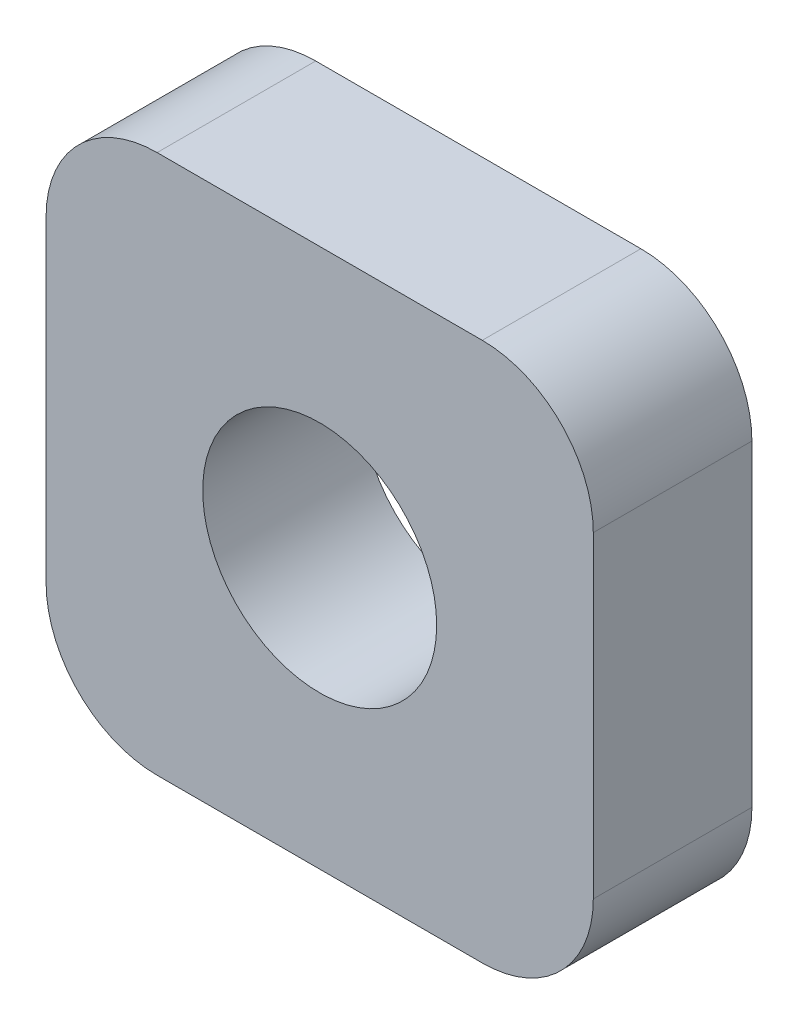
ISO-10303-21;
HEADER;
FILE_DESCRIPTION(('STEP AP214'),'2;1');
FILE_NAME('part.step','',(''),(''),'','','');
FILE_SCHEMA(('AUTOMOTIVE_DESIGN { 1 0 10303 214 1 1 1 1 }'));
ENDSEC;
DATA;
#1=APPLICATION_CONTEXT('core data for automotive mechanical design processes');
#2=APPLICATION_PROTOCOL_DEFINITION('international standard','automotive_design',2000,#1);
#3=PRODUCT_CONTEXT('',#1,'mechanical');
#4=PRODUCT('Part','Part','',(#3));
#5=PRODUCT_RELATED_PRODUCT_CATEGORY('part','',(#4));
#6=PRODUCT_DEFINITION_FORMATION('','',#4);
#7=PRODUCT_DEFINITION_CONTEXT('part definition',#1,'design');
#8=PRODUCT_DEFINITION('design','',#6,#7);
#9=PRODUCT_DEFINITION_SHAPE('','',#8);
#10=(LENGTH_UNIT() NAMED_UNIT(*) SI_UNIT(.MILLI.,.METRE.));
#11=(NAMED_UNIT(*) PLANE_ANGLE_UNIT() SI_UNIT($,.RADIAN.));
#12=(NAMED_UNIT(*) SI_UNIT($,.STERADIAN.) SOLID_ANGLE_UNIT());
#13=UNCERTAINTY_MEASURE_WITH_UNIT(LENGTH_MEASURE(1.E-05),#10,'distance_accuracy_value','');
#14=(GEOMETRIC_REPRESENTATION_CONTEXT(3) GLOBAL_UNCERTAINTY_ASSIGNED_CONTEXT((#13)) GLOBAL_UNIT_ASSIGNED_CONTEXT((#10,
#11,#12)) REPRESENTATION_CONTEXT('',''));
#15=CARTESIAN_POINT('',(0.,0.,0.));
#16=DIRECTION('',(0.,0.,1.));
#17=DIRECTION('',(1.,0.,0.));
#18=AXIS2_PLACEMENT_3D('',#15,#16,#17);
#19=CARTESIAN_POINT('',(-2.05,7.,2.));
#20=DIRECTION('',(0.,0.,1.));
#21=DIRECTION('',(1.,0.,0.));
#22=AXIS2_PLACEMENT_3D('',#19,#20,#21);
#23=PLANE('',#22);
#24=CARTESIAN_POINT('',(-2.05,7.,2.));
#25=DIRECTION('',(0.,0.,1.));
#26=DIRECTION('',(1.,0.,0.));
#27=AXIS2_PLACEMENT_3D('',#24,#25,#26);
#28=CIRCLE('',#27,1.4);
#29=CARTESIAN_POINT('',(-2.05,8.4,2.));
#30=VERTEX_POINT('',#29);
#31=CARTESIAN_POINT('',(-3.45,7.,2.));
#32=VERTEX_POINT('',#31);
#33=EDGE_CURVE('E168',#30,#32,#28,.T.);
#34=ORIENTED_EDGE('',*,*,#33,.T.);
#35=DIRECTION('',(0.,-1.,0.));
#36=VECTOR('',#35,1.);
#37=CARTESIAN_POINT('',(-3.45,7.,2.));
#38=LINE('',#37,#36);
#39=CARTESIAN_POINT('',(-3.45,3.,2.));
#40=VERTEX_POINT('',#39);
#41=EDGE_CURVE('E104',#32,#40,#38,.T.);
#42=ORIENTED_EDGE('',*,*,#41,.T.);
#43=CARTESIAN_POINT('',(-2.05,3.,2.));
#44=DIRECTION('',(0.,0.,1.));
#45=DIRECTION('',(1.,0.,0.));
#46=AXIS2_PLACEMENT_3D('',#43,#44,#45);
#47=CIRCLE('',#46,1.4);
#48=CARTESIAN_POINT('',(-2.05,1.6,2.));
#49=VERTEX_POINT('',#48);
#50=EDGE_CURVE('E189',#40,#49,#47,.T.);
#51=ORIENTED_EDGE('',*,*,#50,.T.);
#52=DIRECTION('',(1.,0.,0.));
#53=VECTOR('',#52,1.);
#54=CARTESIAN_POINT('',(-2.05,1.6,2.));
#55=LINE('',#54,#53);
#56=CARTESIAN_POINT('',(2.05,1.6,2.));
#57=VERTEX_POINT('',#56);
#58=EDGE_CURVE('E203',#49,#57,#55,.T.);
#59=ORIENTED_EDGE('',*,*,#58,.T.);
#60=CARTESIAN_POINT('',(2.05,3.,2.));
#61=DIRECTION('',(0.,0.,1.));
#62=DIRECTION('',(1.,0.,0.));
#63=AXIS2_PLACEMENT_3D('',#60,#61,#62);
#64=CIRCLE('',#63,1.4);
#65=CARTESIAN_POINT('',(3.45,3.,2.));
#66=VERTEX_POINT('',#65);
#67=EDGE_CURVE('E123',#57,#66,#64,.T.);
#68=ORIENTED_EDGE('',*,*,#67,.T.);
#69=DIRECTION('',(0.,1.,0.));
#70=VECTOR('',#69,1.);
#71=CARTESIAN_POINT('',(3.45,3.,2.));
#72=LINE('',#71,#70);
#73=CARTESIAN_POINT('',(3.45,7.,2.));
#74=VERTEX_POINT('',#73);
#75=EDGE_CURVE('E117',#66,#74,#72,.T.);
#76=ORIENTED_EDGE('',*,*,#75,.T.);
#77=CARTESIAN_POINT('',(2.05,7.,2.));
#78=DIRECTION('',(0.,0.,1.));
#79=DIRECTION('',(1.,0.,0.));
#80=AXIS2_PLACEMENT_3D('',#77,#78,#79);
#81=CIRCLE('',#80,1.4);
#82=CARTESIAN_POINT('',(2.05,8.4,2.));
#83=VERTEX_POINT('',#82);
#84=EDGE_CURVE('E121',#74,#83,#81,.T.);
#85=ORIENTED_EDGE('',*,*,#84,.T.);
#86=DIRECTION('',(-1.,0.,0.));
#87=VECTOR('',#86,1.);
#88=CARTESIAN_POINT('',(2.05,8.4,2.));
#89=LINE('',#88,#87);
#90=EDGE_CURVE('E61',#83,#30,#89,.T.);
#91=ORIENTED_EDGE('',*,*,#90,.T.);
#92=EDGE_LOOP('',(#34,#42,#51,#59,#68,#76,#85,#91));
#93=FACE_BOUND('',#92,.T.);
#94=CARTESIAN_POINT('',(0.,5.,2.));
#95=DIRECTION('',(0.,0.,1.));
#96=DIRECTION('',(1.,0.,0.));
#97=AXIS2_PLACEMENT_3D('',#94,#95,#96);
#98=CIRCLE('',#97,1.475);
#99=CARTESIAN_POINT('',(1.475,5.,2.));
#100=VERTEX_POINT('',#99);
#101=EDGE_CURVE('E150',#100,#100,#98,.T.);
#102=ORIENTED_EDGE('',*,*,#101,.F.);
#103=EDGE_LOOP('',(#102));
#104=FACE_BOUND('',#103,.T.);
#105=ADVANCED_FACE('F43',(#93,#104),#23,.T.);
#106=CARTESIAN_POINT('',(-2.05,7.,0.));
#107=DIRECTION('',(0.,0.,1.));
#108=DIRECTION('',(1.,0.,0.));
#109=AXIS2_PLACEMENT_3D('',#106,#107,#108);
#110=PLANE('',#109);
#111=CARTESIAN_POINT('',(-2.05,7.,0.));
#112=DIRECTION('',(0.,0.,1.));
#113=DIRECTION('',(1.,0.,0.));
#114=AXIS2_PLACEMENT_3D('',#111,#112,#113);
#115=CIRCLE('',#114,1.4);
#116=CARTESIAN_POINT('',(-2.05,8.4,0.));
#117=VERTEX_POINT('',#116);
#118=CARTESIAN_POINT('',(-3.45,7.,0.));
#119=VERTEX_POINT('',#118);
#120=EDGE_CURVE('E145',#117,#119,#115,.T.);
#121=ORIENTED_EDGE('',*,*,#120,.F.);
#122=DIRECTION('',(-1.,0.,0.));
#123=VECTOR('',#122,1.);
#124=CARTESIAN_POINT('',(2.05,8.4,0.));
#125=LINE('',#124,#123);
#126=CARTESIAN_POINT('',(2.05,8.4,0.));
#127=VERTEX_POINT('',#126);
#128=EDGE_CURVE('E96',#127,#117,#125,.T.);
#129=ORIENTED_EDGE('',*,*,#128,.F.);
#130=CARTESIAN_POINT('',(2.05,7.,0.));
#131=DIRECTION('',(0.,0.,1.));
#132=DIRECTION('',(1.,0.,0.));
#133=AXIS2_PLACEMENT_3D('',#130,#131,#132);
#134=CIRCLE('',#133,1.4);
#135=CARTESIAN_POINT('',(3.45,7.,0.));
#136=VERTEX_POINT('',#135);
#137=EDGE_CURVE('E90',#136,#127,#134,.T.);
#138=ORIENTED_EDGE('',*,*,#137,.F.);
#139=DIRECTION('',(0.,1.,0.));
#140=VECTOR('',#139,1.);
#141=CARTESIAN_POINT('',(3.45,3.,0.));
#142=LINE('',#141,#140);
#143=CARTESIAN_POINT('',(3.45,3.,0.));
#144=VERTEX_POINT('',#143);
#145=EDGE_CURVE('E132',#144,#136,#142,.T.);
#146=ORIENTED_EDGE('',*,*,#145,.F.);
#147=CARTESIAN_POINT('',(2.05,3.,0.));
#148=DIRECTION('',(0.,0.,1.));
#149=DIRECTION('',(1.,0.,0.));
#150=AXIS2_PLACEMENT_3D('',#147,#148,#149);
#151=CIRCLE('',#150,1.4);
#152=CARTESIAN_POINT('',(2.05,1.6,0.));
#153=VERTEX_POINT('',#152);
#154=EDGE_CURVE('E159',#153,#144,#151,.T.);
#155=ORIENTED_EDGE('',*,*,#154,.F.);
#156=DIRECTION('',(1.,0.,0.));
#157=VECTOR('',#156,1.);
#158=CARTESIAN_POINT('',(-2.05,1.6,0.));
#159=LINE('',#158,#157);
#160=CARTESIAN_POINT('',(-2.05,1.6,0.));
#161=VERTEX_POINT('',#160);
#162=EDGE_CURVE('E156',#161,#153,#159,.T.);
#163=ORIENTED_EDGE('',*,*,#162,.F.);
#164=CARTESIAN_POINT('',(-2.05,3.,0.));
#165=DIRECTION('',(0.,0.,1.));
#166=DIRECTION('',(1.,0.,0.));
#167=AXIS2_PLACEMENT_3D('',#164,#165,#166);
#168=CIRCLE('',#167,1.4);
#169=CARTESIAN_POINT('',(-3.45,3.,0.));
#170=VERTEX_POINT('',#169);
#171=EDGE_CURVE('E153',#170,#161,#168,.T.);
#172=ORIENTED_EDGE('',*,*,#171,.F.);
#173=DIRECTION('',(0.,-1.,0.));
#174=VECTOR('',#173,1.);
#175=CARTESIAN_POINT('',(-3.45,7.,0.));
#176=LINE('',#175,#174);
#177=EDGE_CURVE('E149',#119,#170,#176,.T.);
#178=ORIENTED_EDGE('',*,*,#177,.F.);
#179=EDGE_LOOP('',(#121,#129,#138,#146,#155,#163,#172,#178));
#180=FACE_BOUND('',#179,.T.);
#181=CARTESIAN_POINT('',(0.,5.,0.));
#182=DIRECTION('',(0.,0.,1.));
#183=DIRECTION('',(1.,0.,0.));
#184=AXIS2_PLACEMENT_3D('',#181,#182,#183);
#185=CIRCLE('',#184,1.475);
#186=CARTESIAN_POINT('',(1.475,5.,0.));
#187=VERTEX_POINT('',#186);
#188=EDGE_CURVE('E213',#187,#187,#185,.T.);
#189=ORIENTED_EDGE('',*,*,#188,.T.);
#190=EDGE_LOOP('',(#189));
#191=FACE_BOUND('',#190,.T.);
#192=ADVANCED_FACE('F193',(#180,#191),#110,.F.);
#193=CARTESIAN_POINT('',(-2.05,7.,2.));
#194=DIRECTION('',(0.,0.,-1.));
#195=DIRECTION('',(-1.,0.,0.));
#196=AXIS2_PLACEMENT_3D('',#193,#194,#195);
#197=CYLINDRICAL_SURFACE('',#196,1.4);
#198=ORIENTED_EDGE('',*,*,#120,.T.);
#199=DIRECTION('',(0.,0.,-1.));
#200=VECTOR('',#199,1.);
#201=CARTESIAN_POINT('',(-3.45,7.,2.));
#202=LINE('',#201,#200);
#203=EDGE_CURVE('E11',#32,#119,#202,.T.);
#204=ORIENTED_EDGE('',*,*,#203,.F.);
#205=ORIENTED_EDGE('',*,*,#33,.F.);
#206=DIRECTION('',(0.,0.,-1.));
#207=VECTOR('',#206,1.);
#208=CARTESIAN_POINT('',(-2.05,8.4,2.));
#209=LINE('',#208,#207);
#210=EDGE_CURVE('E141',#30,#117,#209,.T.);
#211=ORIENTED_EDGE('',*,*,#210,.T.);
#212=EDGE_LOOP('',(#198,#204,#205,#211));
#213=FACE_BOUND('',#212,.T.);
#214=ADVANCED_FACE('F45',(#213),#197,.T.);
#215=CARTESIAN_POINT('',(-3.45,7.,2.));
#216=DIRECTION('',(1.,0.,0.));
#217=DIRECTION('',(0.,0.,-1.));
#218=AXIS2_PLACEMENT_3D('',#215,#216,#217);
#219=PLANE('',#218);
#220=ORIENTED_EDGE('',*,*,#177,.T.);
#221=DIRECTION('',(0.,0.,-1.));
#222=VECTOR('',#221,1.);
#223=CARTESIAN_POINT('',(-3.45,3.,2.));
#224=LINE('',#223,#222);
#225=EDGE_CURVE('E53',#40,#170,#224,.T.);
#226=ORIENTED_EDGE('',*,*,#225,.F.);
#227=ORIENTED_EDGE('',*,*,#41,.F.);
#228=ORIENTED_EDGE('',*,*,#203,.T.);
#229=EDGE_LOOP('',(#220,#226,#227,#228));
#230=FACE_BOUND('',#229,.T.);
#231=ADVANCED_FACE('F243',(#230),#219,.F.);
#232=CARTESIAN_POINT('',(-2.05,3.,2.));
#233=DIRECTION('',(0.,0.,-1.));
#234=DIRECTION('',(-1.,0.,0.));
#235=AXIS2_PLACEMENT_3D('',#232,#233,#234);
#236=CYLINDRICAL_SURFACE('',#235,1.4);
#237=ORIENTED_EDGE('',*,*,#171,.T.);
#238=DIRECTION('',(0.,0.,-1.));
#239=VECTOR('',#238,1.);
#240=CARTESIAN_POINT('',(-2.05,1.6,2.));
#241=LINE('',#240,#239);
#242=EDGE_CURVE('E179',#49,#161,#241,.T.);
#243=ORIENTED_EDGE('',*,*,#242,.F.);
#244=ORIENTED_EDGE('',*,*,#50,.F.);
#245=ORIENTED_EDGE('',*,*,#225,.T.);
#246=EDGE_LOOP('',(#237,#243,#244,#245));
#247=FACE_BOUND('',#246,.T.);
#248=ADVANCED_FACE('F187',(#247),#236,.T.);
#249=CARTESIAN_POINT('',(-2.05,1.6,2.));
#250=DIRECTION('',(0.,1.,0.));
#251=DIRECTION('',(-1.,0.,0.));
#252=AXIS2_PLACEMENT_3D('',#249,#250,#251);
#253=PLANE('',#252);
#254=ORIENTED_EDGE('',*,*,#162,.T.);
#255=DIRECTION('',(0.,0.,-1.));
#256=VECTOR('',#255,1.);
#257=CARTESIAN_POINT('',(2.05,1.6,2.));
#258=LINE('',#257,#256);
#259=EDGE_CURVE('E175',#57,#153,#258,.T.);
#260=ORIENTED_EDGE('',*,*,#259,.F.);
#261=ORIENTED_EDGE('',*,*,#58,.F.);
#262=ORIENTED_EDGE('',*,*,#242,.T.);
#263=EDGE_LOOP('',(#254,#260,#261,#262));
#264=FACE_BOUND('',#263,.T.);
#265=ADVANCED_FACE('F198',(#264),#253,.F.);
#266=CARTESIAN_POINT('',(2.05,3.,2.));
#267=DIRECTION('',(0.,0.,-1.));
#268=DIRECTION('',(-1.,0.,0.));
#269=AXIS2_PLACEMENT_3D('',#266,#267,#268);
#270=CYLINDRICAL_SURFACE('',#269,1.4);
#271=ORIENTED_EDGE('',*,*,#154,.T.);
#272=DIRECTION('',(0.,0.,-1.));
#273=VECTOR('',#272,1.);
#274=CARTESIAN_POINT('',(3.45,3.,2.));
#275=LINE('',#274,#273);
#276=EDGE_CURVE('E134',#66,#144,#275,.T.);
#277=ORIENTED_EDGE('',*,*,#276,.F.);
#278=ORIENTED_EDGE('',*,*,#67,.F.);
#279=ORIENTED_EDGE('',*,*,#259,.T.);
#280=EDGE_LOOP('',(#271,#277,#278,#279));
#281=FACE_BOUND('',#280,.T.);
#282=ADVANCED_FACE('F201',(#281),#270,.T.);
#283=CARTESIAN_POINT('',(3.45,3.,2.));
#284=DIRECTION('',(-1.,0.,0.));
#285=DIRECTION('',(0.,-1.,0.));
#286=AXIS2_PLACEMENT_3D('',#283,#284,#285);
#287=PLANE('',#286);
#288=ORIENTED_EDGE('',*,*,#145,.T.);
#289=DIRECTION('',(0.,0.,-1.));
#290=VECTOR('',#289,1.);
#291=CARTESIAN_POINT('',(3.45,7.,2.));
#292=LINE('',#291,#290);
#293=EDGE_CURVE('E129',#74,#136,#292,.T.);
#294=ORIENTED_EDGE('',*,*,#293,.F.);
#295=ORIENTED_EDGE('',*,*,#75,.F.);
#296=ORIENTED_EDGE('',*,*,#276,.T.);
#297=EDGE_LOOP('',(#288,#294,#295,#296));
#298=FACE_BOUND('',#297,.T.);
#299=ADVANCED_FACE('F130',(#298),#287,.F.);
#300=CARTESIAN_POINT('',(2.05,7.,2.));
#301=DIRECTION('',(0.,0.,-1.));
#302=DIRECTION('',(-1.,0.,0.));
#303=AXIS2_PLACEMENT_3D('',#300,#301,#302);
#304=CYLINDRICAL_SURFACE('',#303,1.4);
#305=ORIENTED_EDGE('',*,*,#137,.T.);
#306=DIRECTION('',(0.,0.,-1.));
#307=VECTOR('',#306,1.);
#308=CARTESIAN_POINT('',(2.05,8.4,2.));
#309=LINE('',#308,#307);
#310=EDGE_CURVE('E135',#83,#127,#309,.T.);
#311=ORIENTED_EDGE('',*,*,#310,.F.);
#312=ORIENTED_EDGE('',*,*,#84,.F.);
#313=ORIENTED_EDGE('',*,*,#293,.T.);
#314=EDGE_LOOP('',(#305,#311,#312,#313));
#315=FACE_BOUND('',#314,.T.);
#316=ADVANCED_FACE('F137',(#315),#304,.T.);
#317=CARTESIAN_POINT('',(2.05,8.4,2.));
#318=DIRECTION('',(0.,-1.,0.));
#319=DIRECTION('',(0.,0.,-1.));
#320=AXIS2_PLACEMENT_3D('',#317,#318,#319);
#321=PLANE('',#320);
#322=ORIENTED_EDGE('',*,*,#128,.T.);
#323=ORIENTED_EDGE('',*,*,#210,.F.);
#324=ORIENTED_EDGE('',*,*,#90,.F.);
#325=ORIENTED_EDGE('',*,*,#310,.T.);
#326=EDGE_LOOP('',(#322,#323,#324,#325));
#327=FACE_BOUND('',#326,.T.);
#328=ADVANCED_FACE('F231',(#327),#321,.F.);
#329=CARTESIAN_POINT('',(0.,5.,2.));
#330=DIRECTION('',(0.,0.,-1.));
#331=DIRECTION('',(-1.,0.,0.));
#332=AXIS2_PLACEMENT_3D('',#329,#330,#331);
#333=CYLINDRICAL_SURFACE('',#332,1.475);
#334=ORIENTED_EDGE('',*,*,#101,.T.);
#335=EDGE_LOOP('',(#334));
#336=FACE_BOUND('',#335,.T.);
#337=ORIENTED_EDGE('',*,*,#188,.F.);
#338=EDGE_LOOP('',(#337));
#339=FACE_BOUND('',#338,.T.);
#340=ADVANCED_FACE('F221',(#336,#339),#333,.F.);
#341=CLOSED_SHELL('',(#105,#192,#214,#231,#248,#265,#282,#299,#316,#328,#340));
#342=MANIFOLD_SOLID_BREP('B2',#341);
#343=ADVANCED_BREP_SHAPE_REPRESENTATION('',(#18,#342),#14);
#344=SHAPE_DEFINITION_REPRESENTATION(#9,#343);
ENDSEC;
END-ISO-10303-21;
